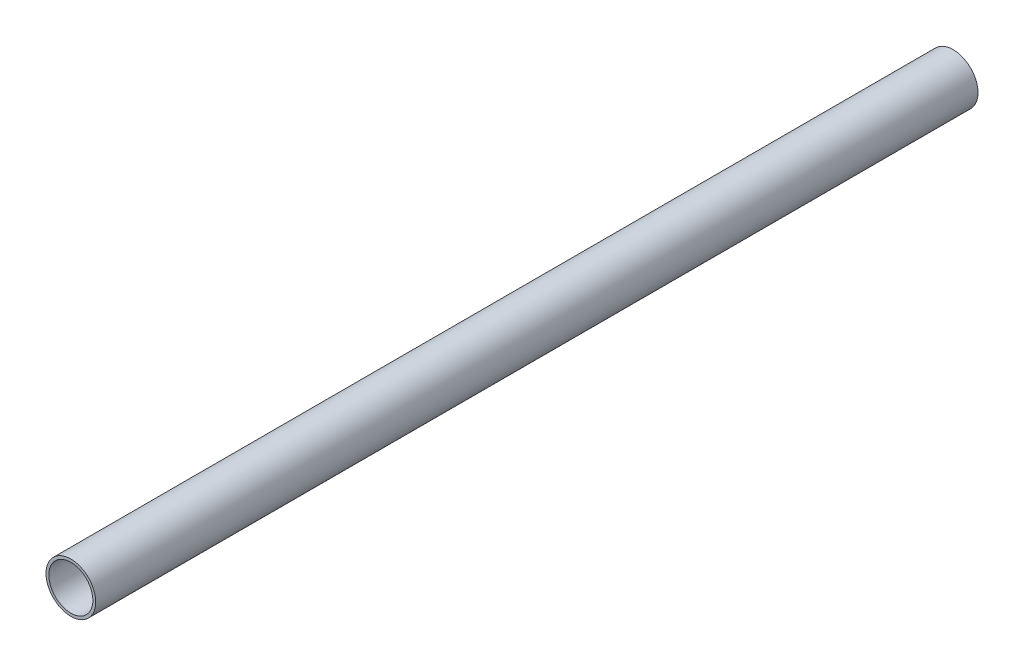
ISO-10303-21;
HEADER;
FILE_DESCRIPTION(('STEP AP214'),'2;1');
FILE_NAME('part.step','',(''),(''),'','','');
FILE_SCHEMA(('AUTOMOTIVE_DESIGN { 1 0 10303 214 1 1 1 1 }'));
ENDSEC;
DATA;
#1=APPLICATION_CONTEXT('core data for automotive mechanical design processes');
#2=APPLICATION_PROTOCOL_DEFINITION('international standard','automotive_design',2000,#1);
#3=PRODUCT_CONTEXT('',#1,'mechanical');
#4=PRODUCT('Part','Part','',(#3));
#5=PRODUCT_RELATED_PRODUCT_CATEGORY('part','',(#4));
#6=PRODUCT_DEFINITION_FORMATION('','',#4);
#7=PRODUCT_DEFINITION_CONTEXT('part definition',#1,'design');
#8=PRODUCT_DEFINITION('design','',#6,#7);
#9=PRODUCT_DEFINITION_SHAPE('','',#8);
#10=(LENGTH_UNIT() NAMED_UNIT(*) SI_UNIT(.MILLI.,.METRE.));
#11=(NAMED_UNIT(*) PLANE_ANGLE_UNIT() SI_UNIT($,.RADIAN.));
#12=(NAMED_UNIT(*) SI_UNIT($,.STERADIAN.) SOLID_ANGLE_UNIT());
#13=UNCERTAINTY_MEASURE_WITH_UNIT(LENGTH_MEASURE(1.E-05),#10,'distance_accuracy_value','');
#14=(GEOMETRIC_REPRESENTATION_CONTEXT(3) GLOBAL_UNCERTAINTY_ASSIGNED_CONTEXT((#13)) GLOBAL_UNIT_ASSIGNED_CONTEXT((#10,
#11,#12)) REPRESENTATION_CONTEXT('',''));
#15=CARTESIAN_POINT('',(0.,0.,0.));
#16=DIRECTION('',(0.,0.,1.));
#17=DIRECTION('',(1.,0.,0.));
#18=AXIS2_PLACEMENT_3D('',#15,#16,#17);
#19=CARTESIAN_POINT('',(0.,0.,0.));
#20=DIRECTION('',(0.,0.,-1.));
#21=DIRECTION('',(0.,-1.,0.));
#22=AXIS2_PLACEMENT_3D('',#19,#20,#21);
#23=CYLINDRICAL_SURFACE('',#22,16.891);
#24=CARTESIAN_POINT('',(0.,0.,-676.402));
#25=DIRECTION('',(0.,0.,1.));
#26=DIRECTION('',(1.,0.,0.));
#27=AXIS2_PLACEMENT_3D('',#24,#25,#26);
#28=CIRCLE('',#27,16.891);
#29=CARTESIAN_POINT('',(16.891,0.,-676.402));
#30=VERTEX_POINT('',#29);
#31=EDGE_CURVE('E25',#30,#30,#28,.T.);
#32=ORIENTED_EDGE('',*,*,#31,.F.);
#33=EDGE_LOOP('',(#32));
#34=FACE_BOUND('',#33,.T.);
#35=CARTESIAN_POINT('',(0.,0.,0.));
#36=DIRECTION('',(0.,0.,-1.));
#37=DIRECTION('',(0.,-1.,0.));
#38=AXIS2_PLACEMENT_3D('',#35,#36,#37);
#39=CIRCLE('',#38,16.891);
#40=CARTESIAN_POINT('',(0.,-16.891,0.));
#41=VERTEX_POINT('',#40);
#42=EDGE_CURVE('E29',#41,#41,#39,.T.);
#43=ORIENTED_EDGE('',*,*,#42,.F.);
#44=EDGE_LOOP('',(#43));
#45=FACE_BOUND('',#44,.T.);
#46=ADVANCED_FACE('F14',(#34,#45),#23,.F.);
#47=CARTESIAN_POINT('',(0.,0.,0.));
#48=DIRECTION('',(0.,0.,-1.));
#49=DIRECTION('',(0.,-1.,0.));
#50=AXIS2_PLACEMENT_3D('',#47,#48,#49);
#51=CYLINDRICAL_SURFACE('',#50,19.05);
#52=CARTESIAN_POINT('',(0.,0.,-676.402));
#53=DIRECTION('',(0.,0.,-1.));
#54=DIRECTION('',(0.,-1.,0.));
#55=AXIS2_PLACEMENT_3D('',#52,#53,#54);
#56=CIRCLE('',#55,19.05);
#57=CARTESIAN_POINT('',(0.,-19.05,-676.402));
#58=VERTEX_POINT('',#57);
#59=EDGE_CURVE('E21',#58,#58,#56,.T.);
#60=ORIENTED_EDGE('',*,*,#59,.F.);
#61=EDGE_LOOP('',(#60));
#62=FACE_BOUND('',#61,.T.);
#63=CARTESIAN_POINT('',(0.,0.,0.));
#64=DIRECTION('',(0.,0.,-1.));
#65=DIRECTION('',(0.,-1.,0.));
#66=AXIS2_PLACEMENT_3D('',#63,#64,#65);
#67=CIRCLE('',#66,19.05);
#68=CARTESIAN_POINT('',(0.,-19.05,0.));
#69=VERTEX_POINT('',#68);
#70=EDGE_CURVE('E9',#69,#69,#67,.T.);
#71=ORIENTED_EDGE('',*,*,#70,.T.);
#72=EDGE_LOOP('',(#71));
#73=FACE_BOUND('',#72,.T.);
#74=ADVANCED_FACE('F16',(#62,#73),#51,.T.);
#75=CARTESIAN_POINT('',(0.,0.,-676.402));
#76=DIRECTION('',(0.,0.,1.));
#77=DIRECTION('',(1.,0.,0.));
#78=AXIS2_PLACEMENT_3D('',#75,#76,#77);
#79=PLANE('',#78);
#80=ORIENTED_EDGE('',*,*,#59,.T.);
#81=EDGE_LOOP('',(#80));
#82=FACE_BOUND('',#81,.T.);
#83=ORIENTED_EDGE('',*,*,#31,.T.);
#84=EDGE_LOOP('',(#83));
#85=FACE_BOUND('',#84,.T.);
#86=ADVANCED_FACE('F43',(#82,#85),#79,.F.);
#87=CARTESIAN_POINT('',(0.,0.,0.));
#88=DIRECTION('',(0.,0.,1.));
#89=DIRECTION('',(1.,0.,0.));
#90=AXIS2_PLACEMENT_3D('',#87,#88,#89);
#91=PLANE('',#90);
#92=ORIENTED_EDGE('',*,*,#70,.F.);
#93=EDGE_LOOP('',(#92));
#94=FACE_BOUND('',#93,.T.);
#95=ORIENTED_EDGE('',*,*,#42,.T.);
#96=EDGE_LOOP('',(#95));
#97=FACE_BOUND('',#96,.T.);
#98=ADVANCED_FACE('F35',(#94,#97),#91,.T.);
#99=CLOSED_SHELL('',(#46,#74,#86,#98));
#100=MANIFOLD_SOLID_BREP('B1',#99);
#101=ADVANCED_BREP_SHAPE_REPRESENTATION('',(#18,#100),#14);
#102=SHAPE_DEFINITION_REPRESENTATION(#9,#101);
ENDSEC;
END-ISO-10303-21;
